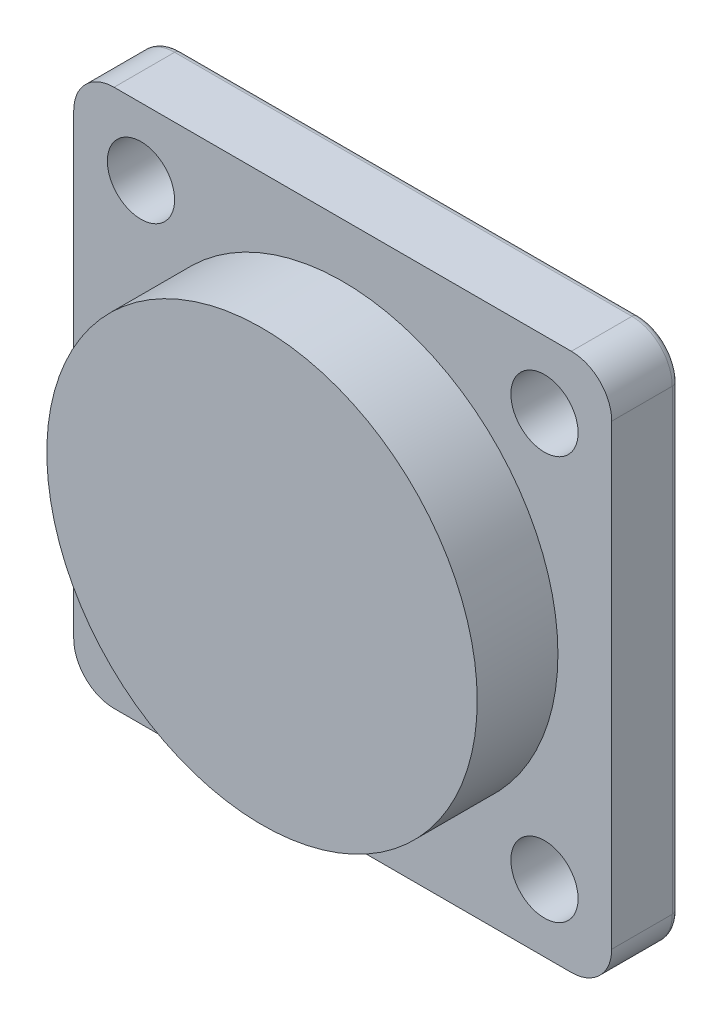
ISO-10303-21;
HEADER;
FILE_DESCRIPTION(('STEP AP214'),'2;1');
FILE_NAME('part.step','',(''),(''),'','','');
FILE_SCHEMA(('AUTOMOTIVE_DESIGN { 1 0 10303 214 1 1 1 1 }'));
ENDSEC;
DATA;
#1=APPLICATION_CONTEXT('core data for automotive mechanical design processes');
#2=APPLICATION_PROTOCOL_DEFINITION('international standard','automotive_design',2000,#1);
#3=PRODUCT_CONTEXT('',#1,'mechanical');
#4=PRODUCT('Part','Part','',(#3));
#5=PRODUCT_RELATED_PRODUCT_CATEGORY('part','',(#4));
#6=PRODUCT_DEFINITION_FORMATION('','',#4);
#7=PRODUCT_DEFINITION_CONTEXT('part definition',#1,'design');
#8=PRODUCT_DEFINITION('design','',#6,#7);
#9=PRODUCT_DEFINITION_SHAPE('','',#8);
#10=(LENGTH_UNIT() NAMED_UNIT(*) SI_UNIT(.MILLI.,.METRE.));
#11=(NAMED_UNIT(*) PLANE_ANGLE_UNIT() SI_UNIT($,.RADIAN.));
#12=(NAMED_UNIT(*) SI_UNIT($,.STERADIAN.) SOLID_ANGLE_UNIT());
#13=UNCERTAINTY_MEASURE_WITH_UNIT(LENGTH_MEASURE(1.E-05),#10,'distance_accuracy_value','');
#14=(GEOMETRIC_REPRESENTATION_CONTEXT(3) GLOBAL_UNCERTAINTY_ASSIGNED_CONTEXT((#13)) GLOBAL_UNIT_ASSIGNED_CONTEXT((#10,
#11,#12)) REPRESENTATION_CONTEXT('',''));
#15=CARTESIAN_POINT('',(0.,0.,0.));
#16=DIRECTION('',(0.,0.,1.));
#17=DIRECTION('',(1.,0.,0.));
#18=AXIS2_PLACEMENT_3D('',#15,#16,#17);
#19=CARTESIAN_POINT('',(0.,0.,-2.5));
#20=DIRECTION('',(0.,0.,1.));
#21=DIRECTION('',(1.,0.,0.));
#22=AXIS2_PLACEMENT_3D('',#19,#20,#21);
#23=PLANE('',#22);
#24=CARTESIAN_POINT('',(-15.,-15.,-2.5));
#25=DIRECTION('',(0.,0.,1.));
#26=DIRECTION('',(1.,0.,0.));
#27=AXIS2_PLACEMENT_3D('',#24,#25,#26);
#28=CIRCLE('',#27,2.5);
#29=CARTESIAN_POINT('',(-12.5,-15.,-2.5));
#30=VERTEX_POINT('',#29);
#31=EDGE_CURVE('E252',#30,#30,#28,.T.);
#32=ORIENTED_EDGE('',*,*,#31,.T.);
#33=EDGE_LOOP('',(#32));
#34=FACE_BOUND('',#33,.T.);
#35=CARTESIAN_POINT('',(15.,-15.,-2.5));
#36=DIRECTION('',(0.,0.,1.));
#37=DIRECTION('',(1.,0.,0.));
#38=AXIS2_PLACEMENT_3D('',#35,#36,#37);
#39=CIRCLE('',#38,2.5);
#40=CARTESIAN_POINT('',(17.5,-15.,-2.5));
#41=VERTEX_POINT('',#40);
#42=EDGE_CURVE('E255',#41,#41,#39,.T.);
#43=ORIENTED_EDGE('',*,*,#42,.T.);
#44=EDGE_LOOP('',(#43));
#45=FACE_BOUND('',#44,.T.);
#46=CARTESIAN_POINT('',(15.,15.,-2.5));
#47=DIRECTION('',(0.,0.,1.));
#48=DIRECTION('',(1.,0.,0.));
#49=AXIS2_PLACEMENT_3D('',#46,#47,#48);
#50=CIRCLE('',#49,2.5);
#51=CARTESIAN_POINT('',(17.5,15.,-2.5));
#52=VERTEX_POINT('',#51);
#53=EDGE_CURVE('E259',#52,#52,#50,.T.);
#54=ORIENTED_EDGE('',*,*,#53,.T.);
#55=EDGE_LOOP('',(#54));
#56=FACE_BOUND('',#55,.T.);
#57=CARTESIAN_POINT('',(-15.,15.,-2.5));
#58=DIRECTION('',(0.,0.,1.));
#59=DIRECTION('',(1.,0.,0.));
#60=AXIS2_PLACEMENT_3D('',#57,#58,#59);
#61=CIRCLE('',#60,2.5);
#62=CARTESIAN_POINT('',(-12.5,15.,-2.5));
#63=VERTEX_POINT('',#62);
#64=EDGE_CURVE('E262',#63,#63,#61,.T.);
#65=ORIENTED_EDGE('',*,*,#64,.T.);
#66=EDGE_LOOP('',(#65));
#67=FACE_BOUND('',#66,.T.);
#68=CARTESIAN_POINT('',(-17.,17.,-2.5));
#69=DIRECTION('',(0.,0.,1.));
#70=DIRECTION('',(1.,0.,0.));
#71=AXIS2_PLACEMENT_3D('',#68,#69,#70);
#72=CIRCLE('',#71,2.5);
#73=CARTESIAN_POINT('',(-17.,19.5,-2.5));
#74=VERTEX_POINT('',#73);
#75=CARTESIAN_POINT('',(-19.5,17.,-2.5));
#76=VERTEX_POINT('',#75);
#77=EDGE_CURVE('E166',#74,#76,#72,.T.);
#78=ORIENTED_EDGE('',*,*,#77,.F.);
#79=DIRECTION('',(1.,0.,0.));
#80=VECTOR('',#79,1.);
#81=CARTESIAN_POINT('',(20.,19.5,-2.5));
#82=LINE('',#81,#80);
#83=CARTESIAN_POINT('',(17.,19.5,-2.5));
#84=VERTEX_POINT('',#83);
#85=EDGE_CURVE('E251',#74,#84,#82,.T.);
#86=ORIENTED_EDGE('',*,*,#85,.T.);
#87=CARTESIAN_POINT('',(17.,17.,-2.5));
#88=DIRECTION('',(0.,0.,1.));
#89=DIRECTION('',(1.,0.,0.));
#90=AXIS2_PLACEMENT_3D('',#87,#88,#89);
#91=CIRCLE('',#90,2.5);
#92=CARTESIAN_POINT('',(19.5,17.,-2.5));
#93=VERTEX_POINT('',#92);
#94=EDGE_CURVE('E167',#93,#84,#91,.T.);
#95=ORIENTED_EDGE('',*,*,#94,.F.);
#96=DIRECTION('',(0.,-1.,0.));
#97=VECTOR('',#96,1.);
#98=CARTESIAN_POINT('',(19.5,-20.,-2.5));
#99=LINE('',#98,#97);
#100=CARTESIAN_POINT('',(19.5,-17.,-2.5));
#101=VERTEX_POINT('',#100);
#102=EDGE_CURVE('E273',#93,#101,#99,.T.);
#103=ORIENTED_EDGE('',*,*,#102,.T.);
#104=CARTESIAN_POINT('',(17.,-17.,-2.5));
#105=DIRECTION('',(0.,0.,1.));
#106=DIRECTION('',(1.,0.,0.));
#107=AXIS2_PLACEMENT_3D('',#104,#105,#106);
#108=CIRCLE('',#107,2.5);
#109=CARTESIAN_POINT('',(17.,-19.5,-2.5));
#110=VERTEX_POINT('',#109);
#111=EDGE_CURVE('E169',#110,#101,#108,.T.);
#112=ORIENTED_EDGE('',*,*,#111,.F.);
#113=DIRECTION('',(1.,0.,0.));
#114=VECTOR('',#113,1.);
#115=CARTESIAN_POINT('',(0.,-19.5,-2.5));
#116=LINE('',#115,#114);
#117=CARTESIAN_POINT('',(-17.,-19.5,-2.5));
#118=VERTEX_POINT('',#117);
#119=EDGE_CURVE('E270',#110,#118,#116,.F.);
#120=ORIENTED_EDGE('',*,*,#119,.T.);
#121=CARTESIAN_POINT('',(-17.,-17.,-2.5));
#122=DIRECTION('',(0.,0.,1.));
#123=DIRECTION('',(1.,0.,0.));
#124=AXIS2_PLACEMENT_3D('',#121,#122,#123);
#125=CIRCLE('',#124,2.5);
#126=CARTESIAN_POINT('',(-19.5,-17.,-2.5));
#127=VERTEX_POINT('',#126);
#128=EDGE_CURVE('E176',#127,#118,#125,.T.);
#129=ORIENTED_EDGE('',*,*,#128,.F.);
#130=DIRECTION('',(0.,-1.,0.));
#131=VECTOR('',#130,1.);
#132=CARTESIAN_POINT('',(-19.5,0.,-2.5));
#133=LINE('',#132,#131);
#134=EDGE_CURVE('E268',#127,#76,#133,.F.);
#135=ORIENTED_EDGE('',*,*,#134,.T.);
#136=EDGE_LOOP('',(#78,#86,#95,#103,#112,#120,#129,#135));
#137=FACE_BOUND('',#136,.T.);
#138=ADVANCED_FACE('F42',(#34,#45,#56,#67,#137),#23,.F.);
#139=CARTESIAN_POINT('',(20.,0.,2.5));
#140=DIRECTION('',(1.,0.,0.));
#141=DIRECTION('',(0.,0.,-1.));
#142=AXIS2_PLACEMENT_3D('',#139,#140,#141);
#143=PLANE('',#142);
#144=DIRECTION('',(0.,-1.,0.));
#145=VECTOR('',#144,1.);
#146=CARTESIAN_POINT('',(20.,20.,-2.));
#147=LINE('',#146,#145);
#148=CARTESIAN_POINT('',(20.,-17.,-2.));
#149=VERTEX_POINT('',#148);
#150=CARTESIAN_POINT('',(20.,17.,-2.));
#151=VERTEX_POINT('',#150);
#152=EDGE_CURVE('E234',#149,#151,#147,.F.);
#153=ORIENTED_EDGE('',*,*,#152,.T.);
#154=DIRECTION('',(0.,0.,-1.));
#155=VECTOR('',#154,1.);
#156=CARTESIAN_POINT('',(20.,17.,2.5));
#157=LINE('',#156,#155);
#158=CARTESIAN_POINT('',(20.,17.,2.5));
#159=VERTEX_POINT('',#158);
#160=EDGE_CURVE('E198',#151,#159,#157,.F.);
#161=ORIENTED_EDGE('',*,*,#160,.T.);
#162=DIRECTION('',(0.,-1.,0.));
#163=VECTOR('',#162,1.);
#164=CARTESIAN_POINT('',(20.,0.,2.5));
#165=LINE('',#164,#163);
#166=CARTESIAN_POINT('',(20.,-17.,2.5));
#167=VERTEX_POINT('',#166);
#168=EDGE_CURVE('E231',#159,#167,#165,.T.);
#169=ORIENTED_EDGE('',*,*,#168,.T.);
#170=DIRECTION('',(0.,0.,-1.));
#171=VECTOR('',#170,1.);
#172=CARTESIAN_POINT('',(20.,-17.,-2.));
#173=LINE('',#172,#171);
#174=EDGE_CURVE('E196',#167,#149,#173,.T.);
#175=ORIENTED_EDGE('',*,*,#174,.T.);
#176=EDGE_LOOP('',(#153,#161,#169,#175));
#177=FACE_BOUND('',#176,.T.);
#178=ADVANCED_FACE('F230',(#177),#143,.T.);
#179=CARTESIAN_POINT('',(0.,20.,2.5));
#180=DIRECTION('',(0.,1.,0.));
#181=DIRECTION('',(0.,0.,1.));
#182=AXIS2_PLACEMENT_3D('',#179,#180,#181);
#183=PLANE('',#182);
#184=DIRECTION('',(1.,0.,0.));
#185=VECTOR('',#184,1.);
#186=CARTESIAN_POINT('',(0.,20.,2.5));
#187=LINE('',#186,#185);
#188=CARTESIAN_POINT('',(-17.,20.,2.5));
#189=VERTEX_POINT('',#188);
#190=CARTESIAN_POINT('',(17.,20.,2.5));
#191=VERTEX_POINT('',#190);
#192=EDGE_CURVE('E239',#189,#191,#187,.T.);
#193=ORIENTED_EDGE('',*,*,#192,.T.);
#194=DIRECTION('',(0.,0.,-1.));
#195=VECTOR('',#194,1.);
#196=CARTESIAN_POINT('',(17.,20.,2.5));
#197=LINE('',#196,#195);
#198=CARTESIAN_POINT('',(17.,20.,-2.));
#199=VERTEX_POINT('',#198);
#200=EDGE_CURVE('E194',#191,#199,#197,.T.);
#201=ORIENTED_EDGE('',*,*,#200,.T.);
#202=DIRECTION('',(1.,0.,0.));
#203=VECTOR('',#202,1.);
#204=CARTESIAN_POINT('',(-20.,20.,-2.));
#205=LINE('',#204,#203);
#206=CARTESIAN_POINT('',(-17.,20.,-2.));
#207=VERTEX_POINT('',#206);
#208=EDGE_CURVE('E152',#199,#207,#205,.F.);
#209=ORIENTED_EDGE('',*,*,#208,.T.);
#210=DIRECTION('',(0.,0.,-1.));
#211=VECTOR('',#210,1.);
#212=CARTESIAN_POINT('',(-17.,20.,2.5));
#213=LINE('',#212,#211);
#214=EDGE_CURVE('E159',#207,#189,#213,.F.);
#215=ORIENTED_EDGE('',*,*,#214,.T.);
#216=EDGE_LOOP('',(#193,#201,#209,#215));
#217=FACE_BOUND('',#216,.T.);
#218=ADVANCED_FACE('F280',(#217),#183,.T.);
#219=CARTESIAN_POINT('',(-20.,0.,2.5));
#220=DIRECTION('',(1.,0.,0.));
#221=DIRECTION('',(0.,0.,-1.));
#222=AXIS2_PLACEMENT_3D('',#219,#220,#221);
#223=PLANE('',#222);
#224=DIRECTION('',(0.,-1.,0.));
#225=VECTOR('',#224,1.);
#226=CARTESIAN_POINT('',(-20.,0.,-2.));
#227=LINE('',#226,#225);
#228=CARTESIAN_POINT('',(-20.,17.,-2.));
#229=VERTEX_POINT('',#228);
#230=CARTESIAN_POINT('',(-20.,-17.,-2.));
#231=VERTEX_POINT('',#230);
#232=EDGE_CURVE('E137',#229,#231,#227,.T.);
#233=ORIENTED_EDGE('',*,*,#232,.T.);
#234=DIRECTION('',(0.,0.,-1.));
#235=VECTOR('',#234,1.);
#236=CARTESIAN_POINT('',(-20.,-17.,2.5));
#237=LINE('',#236,#235);
#238=CARTESIAN_POINT('',(-20.,-17.,2.5));
#239=VERTEX_POINT('',#238);
#240=EDGE_CURVE('E11',#231,#239,#237,.F.);
#241=ORIENTED_EDGE('',*,*,#240,.T.);
#242=DIRECTION('',(0.,-1.,0.));
#243=VECTOR('',#242,1.);
#244=CARTESIAN_POINT('',(-20.,0.,2.5));
#245=LINE('',#244,#243);
#246=CARTESIAN_POINT('',(-20.,17.,2.5));
#247=VERTEX_POINT('',#246);
#248=EDGE_CURVE('E139',#247,#239,#245,.T.);
#249=ORIENTED_EDGE('',*,*,#248,.F.);
#250=DIRECTION('',(0.,0.,-1.));
#251=VECTOR('',#250,1.);
#252=CARTESIAN_POINT('',(-20.,17.,-2.));
#253=LINE('',#252,#251);
#254=EDGE_CURVE('E51',#247,#229,#253,.T.);
#255=ORIENTED_EDGE('',*,*,#254,.T.);
#256=EDGE_LOOP('',(#233,#241,#249,#255));
#257=FACE_BOUND('',#256,.T.);
#258=ADVANCED_FACE('F136',(#257),#223,.F.);
#259=CARTESIAN_POINT('',(-15.,15.,2.5));
#260=DIRECTION('',(0.,0.,-1.));
#261=DIRECTION('',(-1.,0.,0.));
#262=AXIS2_PLACEMENT_3D('',#259,#260,#261);
#263=CYLINDRICAL_SURFACE('',#262,2.5);
#264=CARTESIAN_POINT('',(-15.,15.,2.5));
#265=DIRECTION('',(0.,0.,1.));
#266=DIRECTION('',(1.,0.,0.));
#267=AXIS2_PLACEMENT_3D('',#264,#265,#266);
#268=CIRCLE('',#267,2.5);
#269=CARTESIAN_POINT('',(-12.5,15.,2.5));
#270=VERTEX_POINT('',#269);
#271=EDGE_CURVE('E240',#270,#270,#268,.T.);
#272=ORIENTED_EDGE('',*,*,#271,.T.);
#273=EDGE_LOOP('',(#272));
#274=FACE_BOUND('',#273,.T.);
#275=ORIENTED_EDGE('',*,*,#64,.F.);
#276=EDGE_LOOP('',(#275));
#277=FACE_BOUND('',#276,.T.);
#278=ADVANCED_FACE('F329',(#274,#277),#263,.F.);
#279=CARTESIAN_POINT('',(15.,15.,2.5));
#280=DIRECTION('',(0.,0.,-1.));
#281=DIRECTION('',(-1.,0.,0.));
#282=AXIS2_PLACEMENT_3D('',#279,#280,#281);
#283=CYLINDRICAL_SURFACE('',#282,2.5);
#284=CARTESIAN_POINT('',(15.,15.,2.5));
#285=DIRECTION('',(0.,0.,1.));
#286=DIRECTION('',(1.,0.,0.));
#287=AXIS2_PLACEMENT_3D('',#284,#285,#286);
#288=CIRCLE('',#287,2.5);
#289=CARTESIAN_POINT('',(17.5,15.,2.5));
#290=VERTEX_POINT('',#289);
#291=EDGE_CURVE('E244',#290,#290,#288,.T.);
#292=ORIENTED_EDGE('',*,*,#291,.T.);
#293=EDGE_LOOP('',(#292));
#294=FACE_BOUND('',#293,.T.);
#295=ORIENTED_EDGE('',*,*,#53,.F.);
#296=EDGE_LOOP('',(#295));
#297=FACE_BOUND('',#296,.T.);
#298=ADVANCED_FACE('F334',(#294,#297),#283,.F.);
#299=CARTESIAN_POINT('',(15.,-15.,2.5));
#300=DIRECTION('',(0.,0.,-1.));
#301=DIRECTION('',(-1.,0.,0.));
#302=AXIS2_PLACEMENT_3D('',#299,#300,#301);
#303=CYLINDRICAL_SURFACE('',#302,2.5);
#304=CARTESIAN_POINT('',(15.,-15.,2.5));
#305=DIRECTION('',(0.,0.,1.));
#306=DIRECTION('',(1.,0.,0.));
#307=AXIS2_PLACEMENT_3D('',#304,#305,#306);
#308=CIRCLE('',#307,2.5);
#309=CARTESIAN_POINT('',(17.5,-15.,2.5));
#310=VERTEX_POINT('',#309);
#311=EDGE_CURVE('E527',#310,#310,#308,.T.);
#312=ORIENTED_EDGE('',*,*,#311,.T.);
#313=EDGE_LOOP('',(#312));
#314=FACE_BOUND('',#313,.T.);
#315=ORIENTED_EDGE('',*,*,#42,.F.);
#316=EDGE_LOOP('',(#315));
#317=FACE_BOUND('',#316,.T.);
#318=ADVANCED_FACE('F338',(#314,#317),#303,.F.);
#319=CARTESIAN_POINT('',(-15.,-15.,2.5));
#320=DIRECTION('',(0.,0.,-1.));
#321=DIRECTION('',(-1.,0.,0.));
#322=AXIS2_PLACEMENT_3D('',#319,#320,#321);
#323=CYLINDRICAL_SURFACE('',#322,2.5);
#324=CARTESIAN_POINT('',(-15.,-15.,2.5));
#325=DIRECTION('',(0.,0.,1.));
#326=DIRECTION('',(1.,0.,0.));
#327=AXIS2_PLACEMENT_3D('',#324,#325,#326);
#328=CIRCLE('',#327,2.5);
#329=CARTESIAN_POINT('',(-12.5,-15.,2.5));
#330=VERTEX_POINT('',#329);
#331=EDGE_CURVE('E265',#330,#330,#328,.T.);
#332=ORIENTED_EDGE('',*,*,#331,.T.);
#333=EDGE_LOOP('',(#332));
#334=FACE_BOUND('',#333,.T.);
#335=ORIENTED_EDGE('',*,*,#31,.F.);
#336=EDGE_LOOP('',(#335));
#337=FACE_BOUND('',#336,.T.);
#338=ADVANCED_FACE('F326',(#334,#337),#323,.F.);
#339=CARTESIAN_POINT('',(0.,-20.,2.5));
#340=DIRECTION('',(0.,1.,0.));
#341=DIRECTION('',(0.,0.,1.));
#342=AXIS2_PLACEMENT_3D('',#339,#340,#341);
#343=PLANE('',#342);
#344=DIRECTION('',(1.,0.,0.));
#345=VECTOR('',#344,1.);
#346=CARTESIAN_POINT('',(0.,-20.,-2.));
#347=LINE('',#346,#345);
#348=CARTESIAN_POINT('',(-17.,-20.,-2.));
#349=VERTEX_POINT('',#348);
#350=CARTESIAN_POINT('',(17.,-20.,-2.));
#351=VERTEX_POINT('',#350);
#352=EDGE_CURVE('E153',#349,#351,#347,.T.);
#353=ORIENTED_EDGE('',*,*,#352,.T.);
#354=DIRECTION('',(0.,0.,-1.));
#355=VECTOR('',#354,1.);
#356=CARTESIAN_POINT('',(17.,-20.,2.5));
#357=LINE('',#356,#355);
#358=CARTESIAN_POINT('',(17.,-20.,2.5));
#359=VERTEX_POINT('',#358);
#360=EDGE_CURVE('E59',#351,#359,#357,.F.);
#361=ORIENTED_EDGE('',*,*,#360,.T.);
#362=DIRECTION('',(1.,0.,0.));
#363=VECTOR('',#362,1.);
#364=CARTESIAN_POINT('',(0.,-20.,2.5));
#365=LINE('',#364,#363);
#366=CARTESIAN_POINT('',(-17.,-20.,2.5));
#367=VERTEX_POINT('',#366);
#368=EDGE_CURVE('E249',#367,#359,#365,.T.);
#369=ORIENTED_EDGE('',*,*,#368,.F.);
#370=DIRECTION('',(0.,0.,-1.));
#371=VECTOR('',#370,1.);
#372=CARTESIAN_POINT('',(-17.,-20.,2.5));
#373=LINE('',#372,#371);
#374=EDGE_CURVE('E207',#367,#349,#373,.T.);
#375=ORIENTED_EDGE('',*,*,#374,.T.);
#376=EDGE_LOOP('',(#353,#361,#369,#375));
#377=FACE_BOUND('',#376,.T.);
#378=ADVANCED_FACE('F297',(#377),#343,.F.);
#379=CARTESIAN_POINT('',(0.,0.,2.5));
#380=DIRECTION('',(0.,0.,1.));
#381=DIRECTION('',(1.,0.,0.));
#382=AXIS2_PLACEMENT_3D('',#379,#380,#381);
#383=PLANE('',#382);
#384=CARTESIAN_POINT('',(0.,0.,2.5));
#385=DIRECTION('',(0.,0.,1.));
#386=DIRECTION('',(1.,0.,0.));
#387=AXIS2_PLACEMENT_3D('',#384,#385,#386);
#388=CIRCLE('',#387,16.);
#389=CARTESIAN_POINT('',(16.,0.,2.5));
#390=VERTEX_POINT('',#389);
#391=EDGE_CURVE('E162',#390,#390,#388,.T.);
#392=ORIENTED_EDGE('',*,*,#391,.F.);
#393=EDGE_LOOP('',(#392));
#394=FACE_BOUND('',#393,.T.);
#395=ORIENTED_EDGE('',*,*,#331,.F.);
#396=EDGE_LOOP('',(#395));
#397=FACE_BOUND('',#396,.T.);
#398=ORIENTED_EDGE('',*,*,#311,.F.);
#399=EDGE_LOOP('',(#398));
#400=FACE_BOUND('',#399,.T.);
#401=ORIENTED_EDGE('',*,*,#291,.F.);
#402=EDGE_LOOP('',(#401));
#403=FACE_BOUND('',#402,.T.);
#404=ORIENTED_EDGE('',*,*,#271,.F.);
#405=EDGE_LOOP('',(#404));
#406=FACE_BOUND('',#405,.T.);
#407=ORIENTED_EDGE('',*,*,#168,.F.);
#408=CARTESIAN_POINT('',(17.,17.,2.5));
#409=DIRECTION('',(0.,0.,1.));
#410=DIRECTION('',(1.,0.,0.));
#411=AXIS2_PLACEMENT_3D('',#408,#409,#410);
#412=CIRCLE('',#411,3.);
#413=EDGE_CURVE('E205',#159,#191,#412,.T.);
#414=ORIENTED_EDGE('',*,*,#413,.T.);
#415=ORIENTED_EDGE('',*,*,#192,.F.);
#416=CARTESIAN_POINT('',(-17.,17.,2.5));
#417=DIRECTION('',(0.,0.,1.));
#418=DIRECTION('',(1.,0.,0.));
#419=AXIS2_PLACEMENT_3D('',#416,#417,#418);
#420=CIRCLE('',#419,3.);
#421=EDGE_CURVE('E200',#189,#247,#420,.T.);
#422=ORIENTED_EDGE('',*,*,#421,.T.);
#423=ORIENTED_EDGE('',*,*,#248,.T.);
#424=CARTESIAN_POINT('',(-17.,-17.,2.5));
#425=DIRECTION('',(0.,0.,1.));
#426=DIRECTION('',(1.,0.,0.));
#427=AXIS2_PLACEMENT_3D('',#424,#425,#426);
#428=CIRCLE('',#427,3.);
#429=EDGE_CURVE('E66',#239,#367,#428,.T.);
#430=ORIENTED_EDGE('',*,*,#429,.T.);
#431=ORIENTED_EDGE('',*,*,#368,.T.);
#432=CARTESIAN_POINT('',(17.,-17.,2.5));
#433=DIRECTION('',(0.,0.,1.));
#434=DIRECTION('',(1.,0.,0.));
#435=AXIS2_PLACEMENT_3D('',#432,#433,#434);
#436=CIRCLE('',#435,3.);
#437=EDGE_CURVE('E203',#359,#167,#436,.T.);
#438=ORIENTED_EDGE('',*,*,#437,.T.);
#439=EDGE_LOOP('',(#407,#414,#415,#422,#423,#430,#431,#438));
#440=FACE_BOUND('',#439,.T.);
#441=ADVANCED_FACE('F235',(#394,#397,#400,#403,#406,#440),#383,.T.);
#442=CARTESIAN_POINT('',(0.,0.,8.5));
#443=DIRECTION('',(0.,0.,-1.));
#444=DIRECTION('',(-1.,0.,0.));
#445=AXIS2_PLACEMENT_3D('',#442,#443,#444);
#446=CYLINDRICAL_SURFACE('',#445,16.);
#447=CARTESIAN_POINT('',(0.,0.,8.5));
#448=DIRECTION('',(0.,0.,1.));
#449=DIRECTION('',(1.,0.,0.));
#450=AXIS2_PLACEMENT_3D('',#447,#448,#449);
#451=CIRCLE('',#450,16.);
#452=CARTESIAN_POINT('',(16.,0.,8.5));
#453=VERTEX_POINT('',#452);
#454=EDGE_CURVE('E256',#453,#453,#451,.T.);
#455=ORIENTED_EDGE('',*,*,#454,.F.);
#456=EDGE_LOOP('',(#455));
#457=FACE_BOUND('',#456,.T.);
#458=ORIENTED_EDGE('',*,*,#391,.T.);
#459=EDGE_LOOP('',(#458));
#460=FACE_BOUND('',#459,.T.);
#461=ADVANCED_FACE('F447',(#457,#460),#446,.T.);
#462=CARTESIAN_POINT('',(0.,0.,8.5));
#463=DIRECTION('',(0.,0.,1.));
#464=DIRECTION('',(1.,0.,0.));
#465=AXIS2_PLACEMENT_3D('',#462,#463,#464);
#466=PLANE('',#465);
#467=ORIENTED_EDGE('',*,*,#454,.T.);
#468=EDGE_LOOP('',(#467));
#469=FACE_BOUND('',#468,.T.);
#470=ADVANCED_FACE('F354',(#469),#466,.T.);
#471=CARTESIAN_POINT('',(-19.5,0.,-2.));
#472=DIRECTION('',(0.,-1.,0.));
#473=DIRECTION('',(0.,0.,-1.));
#474=AXIS2_PLACEMENT_3D('',#471,#472,#473);
#475=CYLINDRICAL_SURFACE('',#474,0.5);
#476=ORIENTED_EDGE('',*,*,#232,.F.);
#477=CARTESIAN_POINT('',(-19.5,17.,-2.));
#478=DIRECTION('',(0.,-1.,0.));
#479=DIRECTION('',(0.,0.,-1.));
#480=AXIS2_PLACEMENT_3D('',#477,#478,#479);
#481=CIRCLE('',#480,0.5);
#482=EDGE_CURVE('E149',#229,#76,#481,.T.);
#483=ORIENTED_EDGE('',*,*,#482,.T.);
#484=ORIENTED_EDGE('',*,*,#134,.F.);
#485=CARTESIAN_POINT('',(-19.5,-17.,-2.));
#486=DIRECTION('',(0.,1.,0.));
#487=DIRECTION('',(0.,0.,1.));
#488=AXIS2_PLACEMENT_3D('',#485,#486,#487);
#489=CIRCLE('',#488,0.5);
#490=EDGE_CURVE('E151',#127,#231,#489,.T.);
#491=ORIENTED_EDGE('',*,*,#490,.T.);
#492=EDGE_LOOP('',(#476,#483,#484,#491));
#493=FACE_BOUND('',#492,.T.);
#494=ADVANCED_FACE('F146',(#493),#475,.T.);
#495=CARTESIAN_POINT('',(0.,19.5,-2.));
#496=DIRECTION('',(-1.,0.,0.));
#497=DIRECTION('',(0.,0.,1.));
#498=AXIS2_PLACEMENT_3D('',#495,#496,#497);
#499=CYLINDRICAL_SURFACE('',#498,0.5);
#500=ORIENTED_EDGE('',*,*,#208,.F.);
#501=CARTESIAN_POINT('',(17.,19.5,-2.));
#502=DIRECTION('',(-1.,0.,0.));
#503=DIRECTION('',(0.,0.,1.));
#504=AXIS2_PLACEMENT_3D('',#501,#502,#503);
#505=CIRCLE('',#504,0.5);
#506=EDGE_CURVE('E190',#199,#84,#505,.T.);
#507=ORIENTED_EDGE('',*,*,#506,.T.);
#508=ORIENTED_EDGE('',*,*,#85,.F.);
#509=CARTESIAN_POINT('',(-17.,19.5,-2.));
#510=DIRECTION('',(1.,0.,0.));
#511=DIRECTION('',(0.,0.,-1.));
#512=AXIS2_PLACEMENT_3D('',#509,#510,#511);
#513=CIRCLE('',#512,0.5);
#514=EDGE_CURVE('E188',#74,#207,#513,.T.);
#515=ORIENTED_EDGE('',*,*,#514,.T.);
#516=EDGE_LOOP('',(#500,#507,#508,#515));
#517=FACE_BOUND('',#516,.T.);
#518=ADVANCED_FACE('F282',(#517),#499,.T.);
#519=CARTESIAN_POINT('',(0.,-19.5,-2.));
#520=DIRECTION('',(1.,0.,0.));
#521=DIRECTION('',(0.,0.,-1.));
#522=AXIS2_PLACEMENT_3D('',#519,#520,#521);
#523=CYLINDRICAL_SURFACE('',#522,0.5);
#524=ORIENTED_EDGE('',*,*,#352,.F.);
#525=CARTESIAN_POINT('',(-17.,-19.5,-2.));
#526=DIRECTION('',(1.,0.,0.));
#527=DIRECTION('',(0.,0.,-1.));
#528=AXIS2_PLACEMENT_3D('',#525,#526,#527);
#529=CIRCLE('',#528,0.5);
#530=EDGE_CURVE('E182',#349,#118,#529,.T.);
#531=ORIENTED_EDGE('',*,*,#530,.T.);
#532=ORIENTED_EDGE('',*,*,#119,.F.);
#533=CARTESIAN_POINT('',(17.,-19.5,-2.));
#534=DIRECTION('',(-1.,0.,0.));
#535=DIRECTION('',(0.,0.,1.));
#536=AXIS2_PLACEMENT_3D('',#533,#534,#535);
#537=CIRCLE('',#536,0.5);
#538=EDGE_CURVE('E180',#110,#351,#537,.T.);
#539=ORIENTED_EDGE('',*,*,#538,.T.);
#540=EDGE_LOOP('',(#524,#531,#532,#539));
#541=FACE_BOUND('',#540,.T.);
#542=ADVANCED_FACE('F299',(#541),#523,.T.);
#543=CARTESIAN_POINT('',(19.5,0.,-2.));
#544=DIRECTION('',(0.,1.,0.));
#545=DIRECTION('',(0.,0.,1.));
#546=AXIS2_PLACEMENT_3D('',#543,#544,#545);
#547=CYLINDRICAL_SURFACE('',#546,0.5);
#548=ORIENTED_EDGE('',*,*,#152,.F.);
#549=CARTESIAN_POINT('',(19.5,-17.,-2.));
#550=DIRECTION('',(0.,1.,0.));
#551=DIRECTION('',(0.,0.,1.));
#552=AXIS2_PLACEMENT_3D('',#549,#550,#551);
#553=CIRCLE('',#552,0.5);
#554=EDGE_CURVE('E186',#149,#101,#553,.T.);
#555=ORIENTED_EDGE('',*,*,#554,.T.);
#556=ORIENTED_EDGE('',*,*,#102,.F.);
#557=CARTESIAN_POINT('',(19.5,17.,-2.));
#558=DIRECTION('',(0.,-1.,0.));
#559=DIRECTION('',(0.,0.,-1.));
#560=AXIS2_PLACEMENT_3D('',#557,#558,#559);
#561=CIRCLE('',#560,0.5);
#562=EDGE_CURVE('E184',#93,#151,#561,.T.);
#563=ORIENTED_EDGE('',*,*,#562,.T.);
#564=EDGE_LOOP('',(#548,#555,#556,#563));
#565=FACE_BOUND('',#564,.T.);
#566=ADVANCED_FACE('F302',(#565),#547,.T.);
#567=CARTESIAN_POINT('',(-17.,17.,2.5));
#568=DIRECTION('',(0.,0.,1.));
#569=DIRECTION('',(1.,0.,0.));
#570=AXIS2_PLACEMENT_3D('',#567,#568,#569);
#571=CYLINDRICAL_SURFACE('',#570,3.);
#572=ORIENTED_EDGE('',*,*,#421,.F.);
#573=ORIENTED_EDGE('',*,*,#214,.F.);
#574=CARTESIAN_POINT('',(-17.,17.,-2.));
#575=DIRECTION('',(0.,0.,1.));
#576=DIRECTION('',(1.,0.,0.));
#577=AXIS2_PLACEMENT_3D('',#574,#575,#576);
#578=CIRCLE('',#577,3.);
#579=EDGE_CURVE('E157',#229,#207,#578,.F.);
#580=ORIENTED_EDGE('',*,*,#579,.F.);
#581=ORIENTED_EDGE('',*,*,#254,.F.);
#582=EDGE_LOOP('',(#572,#573,#580,#581));
#583=FACE_BOUND('',#582,.T.);
#584=ADVANCED_FACE('F158',(#583),#571,.T.);
#585=CARTESIAN_POINT('',(-17.,17.,-2.));
#586=DIRECTION('',(0.,0.,1.));
#587=DIRECTION('',(1.,0.,0.));
#588=AXIS2_PLACEMENT_3D('',#585,#586,#587);
#589=TOROIDAL_SURFACE('',#588,2.5,0.5);
#590=ORIENTED_EDGE('',*,*,#482,.F.);
#591=ORIENTED_EDGE('',*,*,#579,.T.);
#592=ORIENTED_EDGE('',*,*,#514,.F.);
#593=ORIENTED_EDGE('',*,*,#77,.T.);
#594=EDGE_LOOP('',(#590,#591,#592,#593));
#595=FACE_BOUND('',#594,.T.);
#596=ADVANCED_FACE('F165',(#595),#589,.T.);
#597=CARTESIAN_POINT('',(-17.,-17.,2.5));
#598=DIRECTION('',(0.,0.,-1.));
#599=DIRECTION('',(-1.,0.,0.));
#600=AXIS2_PLACEMENT_3D('',#597,#598,#599);
#601=CYLINDRICAL_SURFACE('',#600,3.);
#602=ORIENTED_EDGE('',*,*,#429,.F.);
#603=ORIENTED_EDGE('',*,*,#240,.F.);
#604=CARTESIAN_POINT('',(-17.,-17.,-2.));
#605=DIRECTION('',(0.,0.,1.));
#606=DIRECTION('',(1.,0.,0.));
#607=AXIS2_PLACEMENT_3D('',#604,#605,#606);
#608=CIRCLE('',#607,3.);
#609=EDGE_CURVE('E163',#349,#231,#608,.F.);
#610=ORIENTED_EDGE('',*,*,#609,.F.);
#611=ORIENTED_EDGE('',*,*,#374,.F.);
#612=EDGE_LOOP('',(#602,#603,#610,#611));
#613=FACE_BOUND('',#612,.T.);
#614=ADVANCED_FACE('F295',(#613),#601,.T.);
#615=CARTESIAN_POINT('',(-17.,-17.,-2.));
#616=DIRECTION('',(0.,0.,1.));
#617=DIRECTION('',(1.,0.,0.));
#618=AXIS2_PLACEMENT_3D('',#615,#616,#617);
#619=TOROIDAL_SURFACE('',#618,2.5,0.5);
#620=ORIENTED_EDGE('',*,*,#490,.F.);
#621=ORIENTED_EDGE('',*,*,#128,.T.);
#622=ORIENTED_EDGE('',*,*,#530,.F.);
#623=ORIENTED_EDGE('',*,*,#609,.T.);
#624=EDGE_LOOP('',(#620,#621,#622,#623));
#625=FACE_BOUND('',#624,.T.);
#626=ADVANCED_FACE('F291',(#625),#619,.T.);
#627=CARTESIAN_POINT('',(17.,-17.,2.5));
#628=DIRECTION('',(0.,0.,1.));
#629=DIRECTION('',(1.,0.,0.));
#630=AXIS2_PLACEMENT_3D('',#627,#628,#629);
#631=CYLINDRICAL_SURFACE('',#630,3.);
#632=ORIENTED_EDGE('',*,*,#437,.F.);
#633=ORIENTED_EDGE('',*,*,#360,.F.);
#634=CARTESIAN_POINT('',(17.,-17.,-2.));
#635=DIRECTION('',(0.,0.,1.));
#636=DIRECTION('',(1.,0.,0.));
#637=AXIS2_PLACEMENT_3D('',#634,#635,#636);
#638=CIRCLE('',#637,3.);
#639=EDGE_CURVE('E211',#149,#351,#638,.F.);
#640=ORIENTED_EDGE('',*,*,#639,.F.);
#641=ORIENTED_EDGE('',*,*,#174,.F.);
#642=EDGE_LOOP('',(#632,#633,#640,#641));
#643=FACE_BOUND('',#642,.T.);
#644=ADVANCED_FACE('F304',(#643),#631,.T.);
#645=CARTESIAN_POINT('',(17.,-17.,-2.));
#646=DIRECTION('',(0.,0.,1.));
#647=DIRECTION('',(1.,0.,0.));
#648=AXIS2_PLACEMENT_3D('',#645,#646,#647);
#649=TOROIDAL_SURFACE('',#648,2.5,0.5);
#650=ORIENTED_EDGE('',*,*,#538,.F.);
#651=ORIENTED_EDGE('',*,*,#111,.T.);
#652=ORIENTED_EDGE('',*,*,#554,.F.);
#653=ORIENTED_EDGE('',*,*,#639,.T.);
#654=EDGE_LOOP('',(#650,#651,#652,#653));
#655=FACE_BOUND('',#654,.T.);
#656=ADVANCED_FACE('F300',(#655),#649,.T.);
#657=CARTESIAN_POINT('',(17.,17.,2.5));
#658=DIRECTION('',(0.,0.,-1.));
#659=DIRECTION('',(-1.,0.,0.));
#660=AXIS2_PLACEMENT_3D('',#657,#658,#659);
#661=CYLINDRICAL_SURFACE('',#660,3.);
#662=ORIENTED_EDGE('',*,*,#413,.F.);
#663=ORIENTED_EDGE('',*,*,#160,.F.);
#664=CARTESIAN_POINT('',(17.,17.,-2.));
#665=DIRECTION('',(0.,0.,1.));
#666=DIRECTION('',(1.,0.,0.));
#667=AXIS2_PLACEMENT_3D('',#664,#665,#666);
#668=CIRCLE('',#667,3.);
#669=EDGE_CURVE('E46',#199,#151,#668,.F.);
#670=ORIENTED_EDGE('',*,*,#669,.F.);
#671=ORIENTED_EDGE('',*,*,#200,.F.);
#672=EDGE_LOOP('',(#662,#663,#670,#671));
#673=FACE_BOUND('',#672,.T.);
#674=ADVANCED_FACE('F44',(#673),#661,.T.);
#675=CARTESIAN_POINT('',(17.,17.,-2.));
#676=DIRECTION('',(0.,0.,1.));
#677=DIRECTION('',(1.,0.,0.));
#678=AXIS2_PLACEMENT_3D('',#675,#676,#677);
#679=TOROIDAL_SURFACE('',#678,2.5,0.5);
#680=ORIENTED_EDGE('',*,*,#506,.F.);
#681=ORIENTED_EDGE('',*,*,#669,.T.);
#682=ORIENTED_EDGE('',*,*,#562,.F.);
#683=ORIENTED_EDGE('',*,*,#94,.T.);
#684=EDGE_LOOP('',(#680,#681,#682,#683));
#685=FACE_BOUND('',#684,.T.);
#686=ADVANCED_FACE('F221',(#685),#679,.T.);
#687=CLOSED_SHELL('',(#138,#178,#218,#258,#278,#298,#318,#338,#378,#441,#461,#470,#494,#518,
#542,#566,#584,#596,#614,#626,#644,#656,#674,#686));
#688=MANIFOLD_SOLID_BREP('B2',#687);
#689=ADVANCED_BREP_SHAPE_REPRESENTATION('',(#18,#688),#14);
#690=SHAPE_DEFINITION_REPRESENTATION(#9,#689);
ENDSEC;
END-ISO-10303-21;
